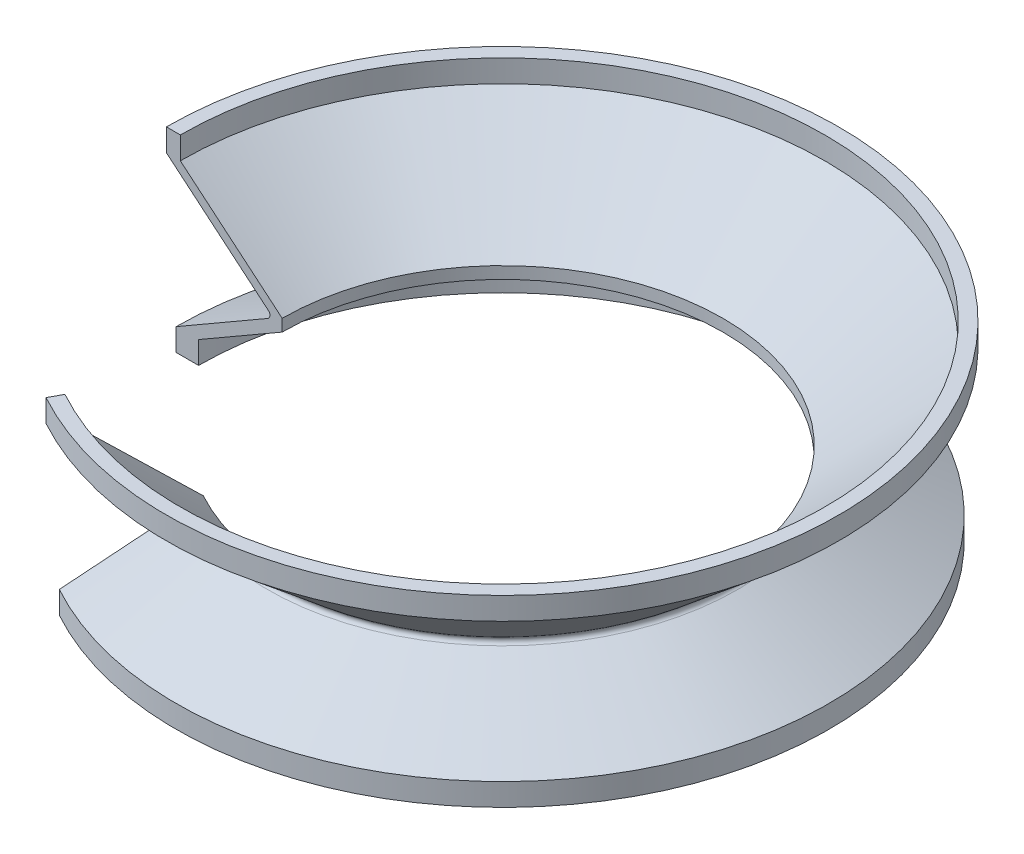
ISO-10303-21;
HEADER;
FILE_DESCRIPTION(('STEP AP214'),'2;1');
FILE_NAME('part.step','',(''),(''),'','','');
FILE_SCHEMA(('AUTOMOTIVE_DESIGN { 1 0 10303 214 1 1 1 1 }'));
ENDSEC;
DATA;
#1=APPLICATION_CONTEXT('core data for automotive mechanical design processes');
#2=APPLICATION_PROTOCOL_DEFINITION('international standard','automotive_design',2000,#1);
#3=PRODUCT_CONTEXT('',#1,'mechanical');
#4=PRODUCT('Part','Part','',(#3));
#5=PRODUCT_RELATED_PRODUCT_CATEGORY('part','',(#4));
#6=PRODUCT_DEFINITION_FORMATION('','',#4);
#7=PRODUCT_DEFINITION_CONTEXT('part definition',#1,'design');
#8=PRODUCT_DEFINITION('design','',#6,#7);
#9=PRODUCT_DEFINITION_SHAPE('','',#8);
#10=(LENGTH_UNIT() NAMED_UNIT(*) SI_UNIT(.MILLI.,.METRE.));
#11=(NAMED_UNIT(*) PLANE_ANGLE_UNIT() SI_UNIT($,.RADIAN.));
#12=(NAMED_UNIT(*) SI_UNIT($,.STERADIAN.) SOLID_ANGLE_UNIT());
#13=UNCERTAINTY_MEASURE_WITH_UNIT(LENGTH_MEASURE(1.E-05),#10,'distance_accuracy_value','');
#14=(GEOMETRIC_REPRESENTATION_CONTEXT(3) GLOBAL_UNCERTAINTY_ASSIGNED_CONTEXT((#13)) GLOBAL_UNIT_ASSIGNED_CONTEXT((#10,
#11,#12)) REPRESENTATION_CONTEXT('',''));
#15=CARTESIAN_POINT('',(0.,0.,0.));
#16=DIRECTION('',(0.,0.,1.));
#17=DIRECTION('',(1.,0.,0.));
#18=AXIS2_PLACEMENT_3D('',#15,#16,#17);
#19=CARTESIAN_POINT('',(21.1287532118802,0.,0.));
#20=DIRECTION('',(0.,-1.,0.));
#21=DIRECTION('',(1.,0.,0.));
#22=AXIS2_PLACEMENT_3D('',#19,#20,#21);
#23=CONICAL_SURFACE('',#22,20.4659712592462,1.0471975511966);
#24=DIRECTION('',(-0.866025403784442,-0.499999999999995,0.));
#25=VECTOR('',#24,1.);
#26=CARTESIAN_POINT('',(0.662781952633966,0.,0.));
#27=LINE('',#26,#25);
#28=CARTESIAN_POINT('',(0.168056970952839,-0.285629601348428,0.));
#29=VERTEX_POINT('',#28);
#30=CARTESIAN_POINT('',(-7.99747208521054,-5.,0.));
#31=VERTEX_POINT('',#30);
#32=EDGE_CURVE('E191',#29,#31,#27,.T.);
#33=ORIENTED_EDGE('',*,*,#32,.F.);
#34=CARTESIAN_POINT('',(21.1287532118802,-0.285629601348425,0.));
#35=DIRECTION('',(0.,-1.,0.));
#36=DIRECTION('',(1.,0.,0.));
#37=AXIS2_PLACEMENT_3D('',#34,#35,#36);
#38=CIRCLE('',#37,20.9606962409273);
#39=CARTESIAN_POINT('',(11.0308607860832,-0.285629601348424,18.3679981342948));
#40=VERTEX_POINT('',#39);
#41=EDGE_CURVE('E67',#29,#40,#38,.T.);
#42=ORIENTED_EDGE('',*,*,#41,.T.);
#43=DIRECTION('',(-0.417210920138585,-0.499999999999995,0.758903846423986));
#44=VECTOR('',#43,1.);
#45=CARTESIAN_POINT('',(11.269196363678,0.,17.9344673280631));
#46=LINE('',#45,#44);
#47=CARTESIAN_POINT('',(7.09708716229209,-5.,25.523505792303));
#48=VERTEX_POINT('',#47);
#49=EDGE_CURVE('E209',#40,#48,#46,.T.);
#50=ORIENTED_EDGE('',*,*,#49,.T.);
#51=CARTESIAN_POINT('',(21.1287532118802,-4.99999999999999,0.));
#52=DIRECTION('',(0.,1.,0.));
#53=DIRECTION('',(-1.,0.,0.));
#54=AXIS2_PLACEMENT_3D('',#51,#52,#53);
#55=CIRCLE('',#54,29.1262252970907);
#56=EDGE_CURVE('E158',#48,#31,#55,.T.);
#57=ORIENTED_EDGE('',*,*,#56,.T.);
#58=EDGE_LOOP('',(#33,#42,#50,#57));
#59=FACE_BOUND('',#58,.T.);
#60=ADVANCED_FACE('F45',(#59),#23,.T.);
#61=CARTESIAN_POINT('',(21.1287532118802,8.00000000000001,0.));
#62=DIRECTION('',(0.,1.,0.));
#63=DIRECTION('',(-1.,0.,0.));
#64=AXIS2_PLACEMENT_3D('',#61,#62,#63);
#65=CONICAL_SURFACE('',#64,30.,0.87266462599717);
#66=DIRECTION('',(0.36904472499778,-0.642787609686535,-0.671289862715641));
#67=VECTOR('',#66,1.);
#68=CARTESIAN_POINT('',(11.269196363678,0.,17.9344673280631));
#69=LINE('',#68,#67);
#70=CARTESIAN_POINT('',(6.6761429888284,8.,26.2892004013157));
#71=VERTEX_POINT('',#70);
#72=CARTESIAN_POINT('',(11.0583761683163,0.367198337412949,18.3179478398165));
#73=VERTEX_POINT('',#72);
#74=EDGE_CURVE('E224',#71,#73,#69,.T.);
#75=ORIENTED_EDGE('',*,*,#74,.T.);
#76=CARTESIAN_POINT('',(21.1287532118802,0.367198337412951,0.));
#77=DIRECTION('',(0.,1.,0.));
#78=DIRECTION('',(-1.,0.,0.));
#79=AXIS2_PLACEMENT_3D('',#76,#77,#78);
#80=CIRCLE('',#79,20.9035811970527);
#81=CARTESIAN_POINT('',(0.225172014827459,0.367198337412948,0.));
#82=VERTEX_POINT('',#81);
#83=EDGE_CURVE('E247',#73,#82,#80,.T.);
#84=ORIENTED_EDGE('',*,*,#83,.T.);
#85=DIRECTION('',(0.766044443118982,-0.642787609686535,0.));
#86=VECTOR('',#85,1.);
#87=CARTESIAN_POINT('',(0.662781952633966,0.,0.));
#88=LINE('',#87,#86);
#89=CARTESIAN_POINT('',(-8.87124678811982,8.,0.));
#90=VERTEX_POINT('',#89);
#91=EDGE_CURVE('E206',#90,#82,#88,.T.);
#92=ORIENTED_EDGE('',*,*,#91,.F.);
#93=CARTESIAN_POINT('',(21.1287532118802,8.00000000000001,0.));
#94=DIRECTION('',(0.,1.,0.));
#95=DIRECTION('',(-1.,0.,0.));
#96=AXIS2_PLACEMENT_3D('',#93,#94,#95);
#97=CIRCLE('',#96,30.);
#98=EDGE_CURVE('E243',#71,#90,#97,.T.);
#99=ORIENTED_EDGE('',*,*,#98,.F.);
#100=EDGE_LOOP('',(#75,#84,#92,#99));
#101=FACE_BOUND('',#100,.T.);
#102=ADVANCED_FACE('F256',(#101),#65,.T.);
#103=CARTESIAN_POINT('',(21.1287532118802,0.373046126524007,0.));
#104=DIRECTION('',(0.,1.,0.));
#105=DIRECTION('',(-1.,0.,0.));
#106=AXIS2_PLACEMENT_3D('',#103,#104,#105);
#107=CONICAL_SURFACE('',#106,19.6659712592462,0.872664625997171);
#108=CARTESIAN_POINT('',(21.1287532118802,0.373046126524007,0.));
#109=DIRECTION('',(0.,1.,0.));
#110=DIRECTION('',(-1.,0.,0.));
#111=AXIS2_PLACEMENT_3D('',#108,#109,#110);
#112=CIRCLE('',#111,19.6659712592462);
#113=CARTESIAN_POINT('',(11.6545993029594,0.373046126524005,17.233421984028));
#114=VERTEX_POINT('',#113);
#115=CARTESIAN_POINT('',(1.46278195263397,0.373046126524002,0.));
#116=VERTEX_POINT('',#115);
#117=EDGE_CURVE('E236',#114,#116,#112,.T.);
#118=ORIENTED_EDGE('',*,*,#117,.F.);
#119=DIRECTION('',(-0.36904472499778,0.642787609686535,0.671289862715641));
#120=VECTOR('',#119,1.);
#121=CARTESIAN_POINT('',(11.6545993029594,0.373046126524005,17.233421984028));
#122=LINE('',#121,#120);
#123=CARTESIAN_POINT('',(7.27572352441048,8.,25.1985674558908));
#124=VERTEX_POINT('',#123);
#125=EDGE_CURVE('E220',#114,#124,#122,.T.);
#126=ORIENTED_EDGE('',*,*,#125,.T.);
#127=CARTESIAN_POINT('',(21.1287532118802,8.00000000000001,0.));
#128=DIRECTION('',(0.,1.,0.));
#129=DIRECTION('',(-1.,0.,0.));
#130=AXIS2_PLACEMENT_3D('',#127,#128,#129);
#131=CIRCLE('',#130,28.7554209385117);
#132=CARTESIAN_POINT('',(-7.62666772663149,8.,0.));
#133=VERTEX_POINT('',#132);
#134=EDGE_CURVE('E239',#124,#133,#131,.T.);
#135=ORIENTED_EDGE('',*,*,#134,.T.);
#136=DIRECTION('',(-0.766044443118982,0.642787609686535,0.));
#137=VECTOR('',#136,1.);
#138=CARTESIAN_POINT('',(1.46278195263397,0.373046126524002,0.));
#139=LINE('',#138,#137);
#140=EDGE_CURVE('E202',#116,#133,#139,.T.);
#141=ORIENTED_EDGE('',*,*,#140,.F.);
#142=EDGE_LOOP('',(#118,#126,#135,#141));
#143=FACE_BOUND('',#142,.T.);
#144=ADVANCED_FACE('F286',(#143),#107,.F.);
#145=CARTESIAN_POINT('',(21.1287532118802,7.60901803281973,0.));
#146=DIRECTION('',(0.,1.,0.));
#147=DIRECTION('',(-1.,0.,0.));
#148=AXIS2_PLACEMENT_3D('',#145,#146,#147);
#149=CYLINDRICAL_SURFACE('',#148,19.6659712592462);
#150=CARTESIAN_POINT('',(21.1287532118802,-0.692820323027548,0.));
#151=DIRECTION('',(0.,1.,0.));
#152=DIRECTION('',(-1.,0.,0.));
#153=AXIS2_PLACEMENT_3D('',#150,#151,#152);
#154=CIRCLE('',#153,19.6659712592462);
#155=CARTESIAN_POINT('',(11.6545993029594,-0.692820323027551,17.233421984028));
#156=VERTEX_POINT('',#155);
#157=CARTESIAN_POINT('',(1.46278195263397,-0.692820323027553,0.));
#158=VERTEX_POINT('',#157);
#159=EDGE_CURVE('E233',#156,#158,#154,.T.);
#160=ORIENTED_EDGE('',*,*,#159,.F.);
#161=DIRECTION('',(0.,1.,0.));
#162=VECTOR('',#161,1.);
#163=CARTESIAN_POINT('',(11.6545993029594,-0.692820323027551,17.233421984028));
#164=LINE('',#163,#162);
#165=EDGE_CURVE('E216',#156,#114,#164,.T.);
#166=ORIENTED_EDGE('',*,*,#165,.T.);
#167=ORIENTED_EDGE('',*,*,#117,.T.);
#168=DIRECTION('',(0.,1.,0.));
#169=VECTOR('',#168,1.);
#170=CARTESIAN_POINT('',(1.46278195263397,-0.692820323027553,0.));
#171=LINE('',#170,#169);
#172=EDGE_CURVE('E198',#158,#116,#171,.T.);
#173=ORIENTED_EDGE('',*,*,#172,.F.);
#174=EDGE_LOOP('',(#160,#166,#167,#173));
#175=FACE_BOUND('',#174,.T.);
#176=ADVANCED_FACE('F291',(#175),#149,.F.);
#177=CARTESIAN_POINT('',(21.1287532118802,-4.99999999999999,0.));
#178=DIRECTION('',(0.,-1.,0.));
#179=DIRECTION('',(1.,0.,0.));
#180=AXIS2_PLACEMENT_3D('',#177,#178,#179);
#181=CONICAL_SURFACE('',#180,27.1262252970907,1.0471975511966);
#182=CARTESIAN_POINT('',(21.1287532118802,-4.99999999999999,0.));
#183=DIRECTION('',(0.,1.,0.));
#184=DIRECTION('',(-1.,0.,0.));
#185=AXIS2_PLACEMENT_3D('',#182,#183,#184);
#186=CIRCLE('',#185,27.1262252970907);
#187=CARTESIAN_POINT('',(8.06059451049553,-5.,23.7708924322152));
#188=VERTEX_POINT('',#187);
#189=CARTESIAN_POINT('',(-5.99747208521052,-5.,0.));
#190=VERTEX_POINT('',#189);
#191=EDGE_CURVE('E230',#188,#190,#186,.T.);
#192=ORIENTED_EDGE('',*,*,#191,.F.);
#193=DIRECTION('',(0.417210920138585,0.499999999999995,-0.758903846423986));
#194=VECTOR('',#193,1.);
#195=CARTESIAN_POINT('',(11.6545993029594,-0.692820323027551,17.233421984028));
#196=LINE('',#195,#194);
#197=EDGE_CURVE('E212',#188,#156,#196,.T.);
#198=ORIENTED_EDGE('',*,*,#197,.T.);
#199=ORIENTED_EDGE('',*,*,#159,.T.);
#200=DIRECTION('',(0.866025403784442,0.499999999999995,0.));
#201=VECTOR('',#200,1.);
#202=CARTESIAN_POINT('',(1.46278195263397,-0.692820323027553,0.));
#203=LINE('',#202,#201);
#204=EDGE_CURVE('E194',#190,#158,#203,.T.);
#205=ORIENTED_EDGE('',*,*,#204,.F.);
#206=EDGE_LOOP('',(#192,#198,#199,#205));
#207=FACE_BOUND('',#206,.T.);
#208=ADVANCED_FACE('F289',(#207),#181,.F.);
#209=CARTESIAN_POINT('',(10.9498987228683,0.,18.5152675805687));
#210=DIRECTION('',(-0.876306680043858,0.,-0.481753674101726));
#211=DIRECTION('',(-0.481753674101726,0.,0.876306680043858));
#212=AXIS2_PLACEMENT_3D('',#209,#210,#211);
#213=PLANE('',#212);
#214=ORIENTED_EDGE('',*,*,#49,.F.);
#215=CARTESIAN_POINT('',(10.9345100512629,0.0607805601653535,18.5432594703036));
#216=DIRECTION('',(-0.876306680043858,0.,-0.481753674101726));
#217=DIRECTION('',(-0.481753674101726,0.,0.876306680043858));
#218=AXIS2_PLACEMENT_3D('',#215,#216,#217);
#219=CIRCLE('',#218,0.4);
#220=EDGE_CURVE('E11',#40,#73,#219,.F.);
#221=ORIENTED_EDGE('',*,*,#220,.T.);
#222=ORIENTED_EDGE('',*,*,#74,.F.);
#223=DIRECTION('',(0.,-1.,0.));
#224=VECTOR('',#223,1.);
#225=CARTESIAN_POINT('',(6.6761429888284,10.,26.2892004013157));
#226=LINE('',#225,#224);
#227=CARTESIAN_POINT('',(6.6761429888284,10.,26.2892004013157));
#228=VERTEX_POINT('',#227);
#229=EDGE_CURVE('E185',#228,#71,#226,.T.);
#230=ORIENTED_EDGE('',*,*,#229,.F.);
#231=DIRECTION('',(-0.481753674101727,0.,0.876306680043857));
#232=VECTOR('',#231,1.);
#233=CARTESIAN_POINT('',(7.27572352441048,10.,25.1985674558908));
#234=LINE('',#233,#232);
#235=CARTESIAN_POINT('',(7.27572352441048,10.,25.1985674558908));
#236=VERTEX_POINT('',#235);
#237=EDGE_CURVE('E165',#236,#228,#234,.T.);
#238=ORIENTED_EDGE('',*,*,#237,.F.);
#239=DIRECTION('',(0.,-1.,0.));
#240=VECTOR('',#239,1.);
#241=CARTESIAN_POINT('',(7.27572352441048,10.,25.1985674558908));
#242=LINE('',#241,#240);
#243=EDGE_CURVE('E188',#236,#124,#242,.T.);
#244=ORIENTED_EDGE('',*,*,#243,.T.);
#245=ORIENTED_EDGE('',*,*,#125,.F.);
#246=ORIENTED_EDGE('',*,*,#165,.F.);
#247=ORIENTED_EDGE('',*,*,#197,.F.);
#248=DIRECTION('',(0.,1.,0.));
#249=VECTOR('',#248,1.);
#250=CARTESIAN_POINT('',(8.06059451049553,-6.99999999999999,23.7708924322152));
#251=LINE('',#250,#249);
#252=CARTESIAN_POINT('',(8.06059451049553,-6.99999999999999,23.7708924322152));
#253=VERTEX_POINT('',#252);
#254=EDGE_CURVE('E141',#253,#188,#251,.T.);
#255=ORIENTED_EDGE('',*,*,#254,.F.);
#256=DIRECTION('',(0.481753674101727,0.,-0.876306680043857));
#257=VECTOR('',#256,1.);
#258=CARTESIAN_POINT('',(7.09708716229209,-6.99999999999999,25.523505792303));
#259=LINE('',#258,#257);
#260=CARTESIAN_POINT('',(7.09708716229209,-6.99999999999999,25.523505792303));
#261=VERTEX_POINT('',#260);
#262=EDGE_CURVE('E134',#261,#253,#259,.T.);
#263=ORIENTED_EDGE('',*,*,#262,.F.);
#264=DIRECTION('',(0.,1.,0.));
#265=VECTOR('',#264,1.);
#266=CARTESIAN_POINT('',(7.09708716229209,-6.99999999999999,25.523505792303));
#267=LINE('',#266,#265);
#268=EDGE_CURVE('E138',#261,#48,#267,.T.);
#269=ORIENTED_EDGE('',*,*,#268,.T.);
#270=EDGE_LOOP('',(#214,#221,#222,#230,#238,#244,#245,#246,#247,#255,#263,#269));
#271=FACE_BOUND('',#270,.T.);
#272=ADVANCED_FACE('F136',(#271),#213,.T.);
#273=CARTESIAN_POINT('',(0.,0.,0.));
#274=DIRECTION('',(0.,0.,-1.));
#275=DIRECTION('',(-1.,0.,0.));
#276=AXIS2_PLACEMENT_3D('',#273,#274,#275);
#277=PLANE('',#276);
#278=ORIENTED_EDGE('',*,*,#91,.T.);
#279=CARTESIAN_POINT('',(-0.0319430290471601,0.060780560165351,0.));
#280=DIRECTION('',(0.,0.,-1.));
#281=DIRECTION('',(-1.,0.,0.));
#282=AXIS2_PLACEMENT_3D('',#279,#280,#281);
#283=CIRCLE('',#282,0.4);
#284=EDGE_CURVE('E54',#82,#29,#283,.T.);
#285=ORIENTED_EDGE('',*,*,#284,.T.);
#286=ORIENTED_EDGE('',*,*,#32,.T.);
#287=DIRECTION('',(0.,1.,0.));
#288=VECTOR('',#287,1.);
#289=CARTESIAN_POINT('',(-7.99747208521054,-7.,0.));
#290=LINE('',#289,#288);
#291=CARTESIAN_POINT('',(-7.99747208521054,-7.,0.));
#292=VERTEX_POINT('',#291);
#293=EDGE_CURVE('E315',#292,#31,#290,.T.);
#294=ORIENTED_EDGE('',*,*,#293,.F.);
#295=DIRECTION('',(-1.,0.,0.));
#296=VECTOR('',#295,1.);
#297=CARTESIAN_POINT('',(-7.99747208521054,-7.,0.));
#298=LINE('',#297,#296);
#299=CARTESIAN_POINT('',(-5.99747208521052,-7.,0.));
#300=VERTEX_POINT('',#299);
#301=EDGE_CURVE('E151',#300,#292,#298,.T.);
#302=ORIENTED_EDGE('',*,*,#301,.F.);
#303=DIRECTION('',(0.,1.,0.));
#304=VECTOR('',#303,1.);
#305=CARTESIAN_POINT('',(-5.99747208521052,-7.,0.));
#306=LINE('',#305,#304);
#307=EDGE_CURVE('E167',#300,#190,#306,.T.);
#308=ORIENTED_EDGE('',*,*,#307,.T.);
#309=ORIENTED_EDGE('',*,*,#204,.T.);
#310=ORIENTED_EDGE('',*,*,#172,.T.);
#311=ORIENTED_EDGE('',*,*,#140,.T.);
#312=DIRECTION('',(0.,-1.,0.));
#313=VECTOR('',#312,1.);
#314=CARTESIAN_POINT('',(-7.62666772663149,10.,0.));
#315=LINE('',#314,#313);
#316=CARTESIAN_POINT('',(-7.62666772663149,10.,0.));
#317=VERTEX_POINT('',#316);
#318=EDGE_CURVE('E179',#317,#133,#315,.T.);
#319=ORIENTED_EDGE('',*,*,#318,.F.);
#320=DIRECTION('',(1.,0.,0.));
#321=VECTOR('',#320,1.);
#322=CARTESIAN_POINT('',(-7.62666772663149,10.,0.));
#323=LINE('',#322,#321);
#324=CARTESIAN_POINT('',(-8.87124678811983,10.,0.));
#325=VERTEX_POINT('',#324);
#326=EDGE_CURVE('E176',#325,#317,#323,.T.);
#327=ORIENTED_EDGE('',*,*,#326,.F.);
#328=DIRECTION('',(0.,-1.,0.));
#329=VECTOR('',#328,1.);
#330=CARTESIAN_POINT('',(-8.87124678811983,10.,0.));
#331=LINE('',#330,#329);
#332=EDGE_CURVE('E182',#325,#90,#331,.T.);
#333=ORIENTED_EDGE('',*,*,#332,.T.);
#334=EDGE_LOOP('',(#278,#285,#286,#294,#302,#308,#309,#310,#311,#319,#327,#333));
#335=FACE_BOUND('',#334,.T.);
#336=ADVANCED_FACE('F261',(#335),#277,.F.);
#337=CARTESIAN_POINT('',(21.1287532118802,0.0607805601653558,0.));
#338=DIRECTION('',(0.,1.,0.));
#339=DIRECTION('',(-1.,0.,0.));
#340=AXIS2_PLACEMENT_3D('',#337,#338,#339);
#341=TOROIDAL_SURFACE('',#340,21.1606962409273,0.4);
#342=ORIENTED_EDGE('',*,*,#220,.F.);
#343=ORIENTED_EDGE('',*,*,#41,.F.);
#344=ORIENTED_EDGE('',*,*,#284,.F.);
#345=ORIENTED_EDGE('',*,*,#83,.F.);
#346=EDGE_LOOP('',(#342,#343,#344,#345));
#347=FACE_BOUND('',#346,.T.);
#348=ADVANCED_FACE('F47',(#347),#341,.F.);
#349=CARTESIAN_POINT('',(21.1287532118802,10.,0.));
#350=DIRECTION('',(0.,-1.,0.));
#351=DIRECTION('',(1.,0.,0.));
#352=AXIS2_PLACEMENT_3D('',#349,#350,#351);
#353=CYLINDRICAL_SURFACE('',#352,28.7554209385117);
#354=ORIENTED_EDGE('',*,*,#134,.F.);
#355=ORIENTED_EDGE('',*,*,#243,.F.);
#356=CARTESIAN_POINT('',(21.1287532118802,10.,0.));
#357=DIRECTION('',(0.,-1.,0.));
#358=DIRECTION('',(-1.,0.,0.));
#359=AXIS2_PLACEMENT_3D('',#356,#357,#358);
#360=CIRCLE('',#359,28.7554209385117);
#361=EDGE_CURVE('E160',#317,#236,#360,.T.);
#362=ORIENTED_EDGE('',*,*,#361,.F.);
#363=ORIENTED_EDGE('',*,*,#318,.T.);
#364=EDGE_LOOP('',(#354,#355,#362,#363));
#365=FACE_BOUND('',#364,.T.);
#366=ADVANCED_FACE('F270',(#365),#353,.F.);
#367=CARTESIAN_POINT('',(21.1287532118802,10.,0.));
#368=DIRECTION('',(0.,-1.,0.));
#369=DIRECTION('',(1.,0.,0.));
#370=AXIS2_PLACEMENT_3D('',#367,#368,#369);
#371=CYLINDRICAL_SURFACE('',#370,30.);
#372=ORIENTED_EDGE('',*,*,#98,.T.);
#373=ORIENTED_EDGE('',*,*,#332,.F.);
#374=CARTESIAN_POINT('',(21.1287532118802,10.,0.));
#375=DIRECTION('',(0.,1.,0.));
#376=DIRECTION('',(-1.,0.,0.));
#377=AXIS2_PLACEMENT_3D('',#374,#375,#376);
#378=CIRCLE('',#377,30.);
#379=EDGE_CURVE('E173',#228,#325,#378,.T.);
#380=ORIENTED_EDGE('',*,*,#379,.F.);
#381=ORIENTED_EDGE('',*,*,#229,.T.);
#382=EDGE_LOOP('',(#372,#373,#380,#381));
#383=FACE_BOUND('',#382,.T.);
#384=ADVANCED_FACE('F267',(#383),#371,.T.);
#385=CARTESIAN_POINT('',(21.1287532118802,10.,0.));
#386=DIRECTION('',(0.,1.,0.));
#387=DIRECTION('',(-1.,0.,0.));
#388=AXIS2_PLACEMENT_3D('',#385,#386,#387);
#389=PLANE('',#388);
#390=ORIENTED_EDGE('',*,*,#361,.T.);
#391=ORIENTED_EDGE('',*,*,#237,.T.);
#392=ORIENTED_EDGE('',*,*,#379,.T.);
#393=ORIENTED_EDGE('',*,*,#326,.T.);
#394=EDGE_LOOP('',(#390,#391,#392,#393));
#395=FACE_BOUND('',#394,.T.);
#396=ADVANCED_FACE('F327',(#395),#389,.T.);
#397=CARTESIAN_POINT('',(21.1287532118802,-6.99999999999999,0.));
#398=DIRECTION('',(0.,1.,0.));
#399=DIRECTION('',(-1.,0.,0.));
#400=AXIS2_PLACEMENT_3D('',#397,#398,#399);
#401=CYLINDRICAL_SURFACE('',#400,29.1262252970907);
#402=ORIENTED_EDGE('',*,*,#56,.F.);
#403=ORIENTED_EDGE('',*,*,#268,.F.);
#404=CARTESIAN_POINT('',(21.1287532118802,-6.99999999999999,0.));
#405=DIRECTION('',(0.,-1.,0.));
#406=DIRECTION('',(1.,0.,0.));
#407=AXIS2_PLACEMENT_3D('',#404,#405,#406);
#408=CIRCLE('',#407,29.1262252970907);
#409=EDGE_CURVE('E146',#292,#261,#408,.T.);
#410=ORIENTED_EDGE('',*,*,#409,.F.);
#411=ORIENTED_EDGE('',*,*,#293,.T.);
#412=EDGE_LOOP('',(#402,#403,#410,#411));
#413=FACE_BOUND('',#412,.T.);
#414=ADVANCED_FACE('F156',(#413),#401,.T.);
#415=CARTESIAN_POINT('',(21.1287532118802,-6.99999999999999,0.));
#416=DIRECTION('',(0.,1.,0.));
#417=DIRECTION('',(-1.,0.,0.));
#418=AXIS2_PLACEMENT_3D('',#415,#416,#417);
#419=CYLINDRICAL_SURFACE('',#418,27.1262252970907);
#420=ORIENTED_EDGE('',*,*,#191,.T.);
#421=ORIENTED_EDGE('',*,*,#307,.F.);
#422=CARTESIAN_POINT('',(21.1287532118802,-6.99999999999999,0.));
#423=DIRECTION('',(0.,1.,0.));
#424=DIRECTION('',(1.,0.,0.));
#425=AXIS2_PLACEMENT_3D('',#422,#423,#424);
#426=CIRCLE('',#425,27.1262252970907);
#427=EDGE_CURVE('E145',#253,#300,#426,.T.);
#428=ORIENTED_EDGE('',*,*,#427,.F.);
#429=ORIENTED_EDGE('',*,*,#254,.T.);
#430=EDGE_LOOP('',(#420,#421,#428,#429));
#431=FACE_BOUND('',#430,.T.);
#432=ADVANCED_FACE('F311',(#431),#419,.F.);
#433=CARTESIAN_POINT('',(21.1287532118802,-6.99999999999999,0.));
#434=DIRECTION('',(0.,-1.,0.));
#435=DIRECTION('',(1.,0.,0.));
#436=AXIS2_PLACEMENT_3D('',#433,#434,#435);
#437=PLANE('',#436);
#438=ORIENTED_EDGE('',*,*,#409,.T.);
#439=ORIENTED_EDGE('',*,*,#262,.T.);
#440=ORIENTED_EDGE('',*,*,#427,.T.);
#441=ORIENTED_EDGE('',*,*,#301,.T.);
#442=EDGE_LOOP('',(#438,#439,#440,#441));
#443=FACE_BOUND('',#442,.T.);
#444=ADVANCED_FACE('F149',(#443),#437,.T.);
#445=CLOSED_SHELL('',(#60,#102,#144,#176,#208,#272,#336,#348,#366,#384,#396,#414,#432,#444));
#446=MANIFOLD_SOLID_BREP('B2',#445);
#447=ADVANCED_BREP_SHAPE_REPRESENTATION('',(#18,#446),#14);
#448=SHAPE_DEFINITION_REPRESENTATION(#9,#447);
ENDSEC;
END-ISO-10303-21;
